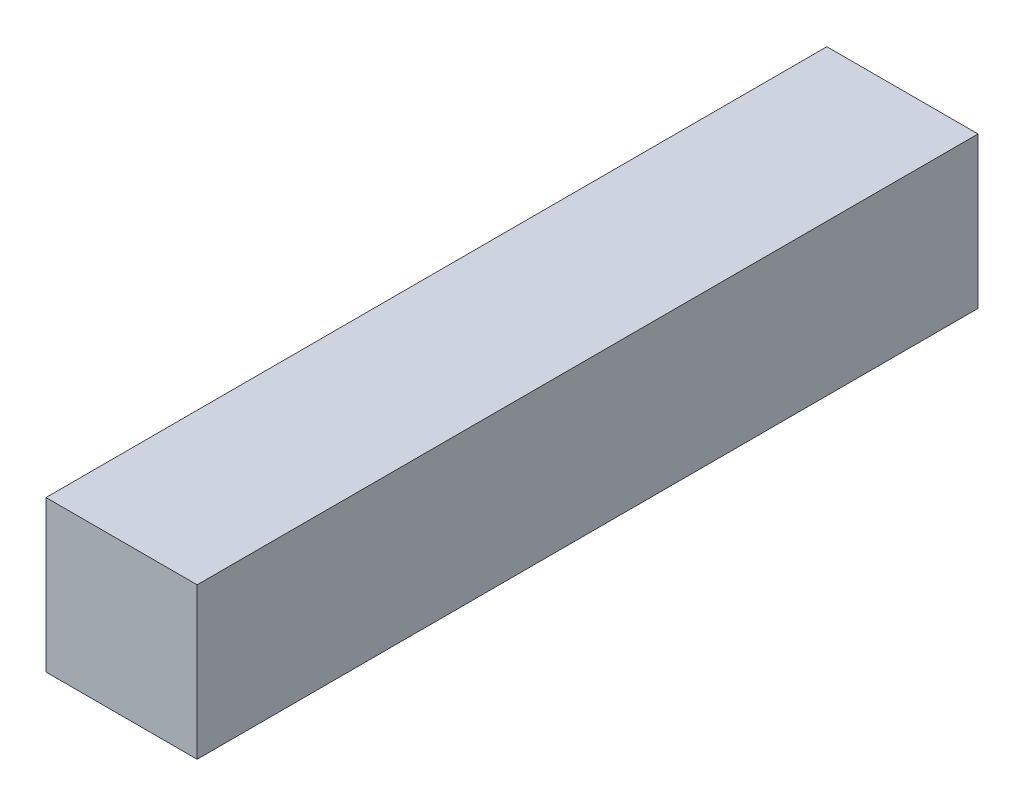
ISO-10303-21;
HEADER;
FILE_DESCRIPTION(('STEP AP214'),'2;1');
FILE_NAME('part.step','',(''),(''),'','','');
FILE_SCHEMA(('AUTOMOTIVE_DESIGN { 1 0 10303 214 1 1 1 1 }'));
ENDSEC;
DATA;
#1=APPLICATION_CONTEXT('core data for automotive mechanical design processes');
#2=APPLICATION_PROTOCOL_DEFINITION('international standard','automotive_design',2000,#1);
#3=PRODUCT_CONTEXT('',#1,'mechanical');
#4=PRODUCT('Part','Part','',(#3));
#5=PRODUCT_RELATED_PRODUCT_CATEGORY('part','',(#4));
#6=PRODUCT_DEFINITION_FORMATION('','',#4);
#7=PRODUCT_DEFINITION_CONTEXT('part definition',#1,'design');
#8=PRODUCT_DEFINITION('design','',#6,#7);
#9=PRODUCT_DEFINITION_SHAPE('','',#8);
#10=(LENGTH_UNIT() NAMED_UNIT(*) SI_UNIT(.MILLI.,.METRE.));
#11=(NAMED_UNIT(*) PLANE_ANGLE_UNIT() SI_UNIT($,.RADIAN.));
#12=(NAMED_UNIT(*) SI_UNIT($,.STERADIAN.) SOLID_ANGLE_UNIT());
#13=UNCERTAINTY_MEASURE_WITH_UNIT(LENGTH_MEASURE(1.E-05),#10,'distance_accuracy_value','');
#14=(GEOMETRIC_REPRESENTATION_CONTEXT(3) GLOBAL_UNCERTAINTY_ASSIGNED_CONTEXT((#13)) GLOBAL_UNIT_ASSIGNED_CONTEXT((#10,
#11,#12)) REPRESENTATION_CONTEXT('',''));
#15=CARTESIAN_POINT('',(0.,0.,0.));
#16=DIRECTION('',(0.,0.,1.));
#17=DIRECTION('',(1.,0.,0.));
#18=AXIS2_PLACEMENT_3D('',#15,#16,#17);
#19=CARTESIAN_POINT('',(38.1,76.2,196.85));
#20=DIRECTION('',(-1.,0.,0.));
#21=DIRECTION('',(0.,0.,1.));
#22=AXIS2_PLACEMENT_3D('',#19,#20,#21);
#23=PLANE('',#22);
#24=DIRECTION('',(0.,0.,-1.));
#25=VECTOR('',#24,1.);
#26=CARTESIAN_POINT('',(38.1,0.,196.85));
#27=LINE('',#26,#25);
#28=CARTESIAN_POINT('',(38.1,0.,196.85));
#29=VERTEX_POINT('',#28);
#30=CARTESIAN_POINT('',(38.1,0.,-196.85));
#31=VERTEX_POINT('',#30);
#32=EDGE_CURVE('E107',#29,#31,#27,.T.);
#33=ORIENTED_EDGE('',*,*,#32,.T.);
#34=DIRECTION('',(0.,-1.,0.));
#35=VECTOR('',#34,1.);
#36=CARTESIAN_POINT('',(38.1,76.2,-196.85));
#37=LINE('',#36,#35);
#38=CARTESIAN_POINT('',(38.1,76.2,-196.85));
#39=VERTEX_POINT('',#38);
#40=EDGE_CURVE('E11',#39,#31,#37,.T.);
#41=ORIENTED_EDGE('',*,*,#40,.F.);
#42=DIRECTION('',(0.,0.,-1.));
#43=VECTOR('',#42,1.);
#44=CARTESIAN_POINT('',(38.1,76.2,196.85));
#45=LINE('',#44,#43);
#46=CARTESIAN_POINT('',(38.1,76.2,196.85));
#47=VERTEX_POINT('',#46);
#48=EDGE_CURVE('E91',#47,#39,#45,.T.);
#49=ORIENTED_EDGE('',*,*,#48,.F.);
#50=DIRECTION('',(0.,-1.,0.));
#51=VECTOR('',#50,1.);
#52=CARTESIAN_POINT('',(38.1,76.2,196.85));
#53=LINE('',#52,#51);
#54=EDGE_CURVE('E103',#47,#29,#53,.T.);
#55=ORIENTED_EDGE('',*,*,#54,.T.);
#56=EDGE_LOOP('',(#33,#41,#49,#55));
#57=FACE_BOUND('',#56,.T.);
#58=ADVANCED_FACE('F39',(#57),#23,.F.);
#59=CARTESIAN_POINT('',(-38.1000000000001,76.2,-196.85));
#60=DIRECTION('',(0.,0.,1.));
#61=DIRECTION('',(1.,0.,0.));
#62=AXIS2_PLACEMENT_3D('',#59,#60,#61);
#63=PLANE('',#62);
#64=DIRECTION('',(-1.,0.,0.));
#65=VECTOR('',#64,1.);
#66=CARTESIAN_POINT('',(-38.1000000000001,0.,-196.85));
#67=LINE('',#66,#65);
#68=CARTESIAN_POINT('',(-38.1000000000001,0.,-196.85));
#69=VERTEX_POINT('',#68);
#70=EDGE_CURVE('E96',#31,#69,#67,.T.);
#71=ORIENTED_EDGE('',*,*,#70,.T.);
#72=DIRECTION('',(0.,-1.,0.));
#73=VECTOR('',#72,1.);
#74=CARTESIAN_POINT('',(-38.1000000000001,76.2,-196.85));
#75=LINE('',#74,#73);
#76=CARTESIAN_POINT('',(-38.1000000000001,76.2,-196.85));
#77=VERTEX_POINT('',#76);
#78=EDGE_CURVE('E48',#77,#69,#75,.T.);
#79=ORIENTED_EDGE('',*,*,#78,.F.);
#80=DIRECTION('',(-1.,0.,0.));
#81=VECTOR('',#80,1.);
#82=CARTESIAN_POINT('',(-38.1000000000001,76.2,-196.85));
#83=LINE('',#82,#81);
#84=EDGE_CURVE('E86',#39,#77,#83,.T.);
#85=ORIENTED_EDGE('',*,*,#84,.F.);
#86=ORIENTED_EDGE('',*,*,#40,.T.);
#87=EDGE_LOOP('',(#71,#79,#85,#86));
#88=FACE_BOUND('',#87,.T.);
#89=ADVANCED_FACE('F95',(#88),#63,.F.);
#90=CARTESIAN_POINT('',(-38.1000000000001,76.2,196.85));
#91=DIRECTION('',(1.,0.,0.));
#92=DIRECTION('',(0.,0.,-1.));
#93=AXIS2_PLACEMENT_3D('',#90,#91,#92);
#94=PLANE('',#93);
#95=DIRECTION('',(0.,0.,1.));
#96=VECTOR('',#95,1.);
#97=CARTESIAN_POINT('',(-38.1000000000001,0.,196.85));
#98=LINE('',#97,#96);
#99=CARTESIAN_POINT('',(-38.1000000000001,0.,196.85));
#100=VERTEX_POINT('',#99);
#101=EDGE_CURVE('E73',#69,#100,#98,.T.);
#102=ORIENTED_EDGE('',*,*,#101,.T.);
#103=DIRECTION('',(0.,-1.,0.));
#104=VECTOR('',#103,1.);
#105=CARTESIAN_POINT('',(-38.1000000000001,76.2,196.85));
#106=LINE('',#105,#104);
#107=CARTESIAN_POINT('',(-38.1000000000001,76.2,196.85));
#108=VERTEX_POINT('',#107);
#109=EDGE_CURVE('E98',#108,#100,#106,.T.);
#110=ORIENTED_EDGE('',*,*,#109,.F.);
#111=DIRECTION('',(0.,0.,1.));
#112=VECTOR('',#111,1.);
#113=CARTESIAN_POINT('',(-38.1000000000001,76.2,196.85));
#114=LINE('',#113,#112);
#115=EDGE_CURVE('E89',#77,#108,#114,.T.);
#116=ORIENTED_EDGE('',*,*,#115,.F.);
#117=ORIENTED_EDGE('',*,*,#78,.T.);
#118=EDGE_LOOP('',(#102,#110,#116,#117));
#119=FACE_BOUND('',#118,.T.);
#120=ADVANCED_FACE('F99',(#119),#94,.F.);
#121=CARTESIAN_POINT('',(-38.1000000000001,76.2,196.85));
#122=DIRECTION('',(0.,0.,-1.));
#123=DIRECTION('',(-1.,0.,0.));
#124=AXIS2_PLACEMENT_3D('',#121,#122,#123);
#125=PLANE('',#124);
#126=DIRECTION('',(1.,0.,0.));
#127=VECTOR('',#126,1.);
#128=CARTESIAN_POINT('',(-38.1000000000001,0.,196.85));
#129=LINE('',#128,#127);
#130=EDGE_CURVE('E79',#100,#29,#129,.T.);
#131=ORIENTED_EDGE('',*,*,#130,.T.);
#132=ORIENTED_EDGE('',*,*,#54,.F.);
#133=DIRECTION('',(1.,0.,0.));
#134=VECTOR('',#133,1.);
#135=CARTESIAN_POINT('',(-38.1000000000001,76.2,196.85));
#136=LINE('',#135,#134);
#137=EDGE_CURVE('E56',#108,#47,#136,.T.);
#138=ORIENTED_EDGE('',*,*,#137,.F.);
#139=ORIENTED_EDGE('',*,*,#109,.T.);
#140=EDGE_LOOP('',(#131,#132,#138,#139));
#141=FACE_BOUND('',#140,.T.);
#142=ADVANCED_FACE('F120',(#141),#125,.F.);
#143=CARTESIAN_POINT('',(0.,76.2,0.));
#144=DIRECTION('',(0.,-1.,0.));
#145=DIRECTION('',(0.,0.,-1.));
#146=AXIS2_PLACEMENT_3D('',#143,#144,#145);
#147=PLANE('',#146);
#148=ORIENTED_EDGE('',*,*,#48,.T.);
#149=ORIENTED_EDGE('',*,*,#84,.T.);
#150=ORIENTED_EDGE('',*,*,#115,.T.);
#151=ORIENTED_EDGE('',*,*,#137,.T.);
#152=EDGE_LOOP('',(#148,#149,#150,#151));
#153=FACE_BOUND('',#152,.T.);
#154=ADVANCED_FACE('F87',(#153),#147,.F.);
#155=CARTESIAN_POINT('',(0.,0.,0.));
#156=DIRECTION('',(0.,-1.,0.));
#157=DIRECTION('',(0.,0.,-1.));
#158=AXIS2_PLACEMENT_3D('',#155,#156,#157);
#159=PLANE('',#158);
#160=ORIENTED_EDGE('',*,*,#32,.F.);
#161=ORIENTED_EDGE('',*,*,#130,.F.);
#162=ORIENTED_EDGE('',*,*,#101,.F.);
#163=ORIENTED_EDGE('',*,*,#70,.F.);
#164=EDGE_LOOP('',(#160,#161,#162,#163));
#165=FACE_BOUND('',#164,.T.);
#166=ADVANCED_FACE('F123',(#165),#159,.T.);
#167=CLOSED_SHELL('',(#58,#89,#120,#142,#154,#166));
#168=MANIFOLD_SOLID_BREP('B2',#167);
#169=ADVANCED_BREP_SHAPE_REPRESENTATION('',(#18,#168),#14);
#170=SHAPE_DEFINITION_REPRESENTATION(#9,#169);
ENDSEC;
END-ISO-10303-21;
